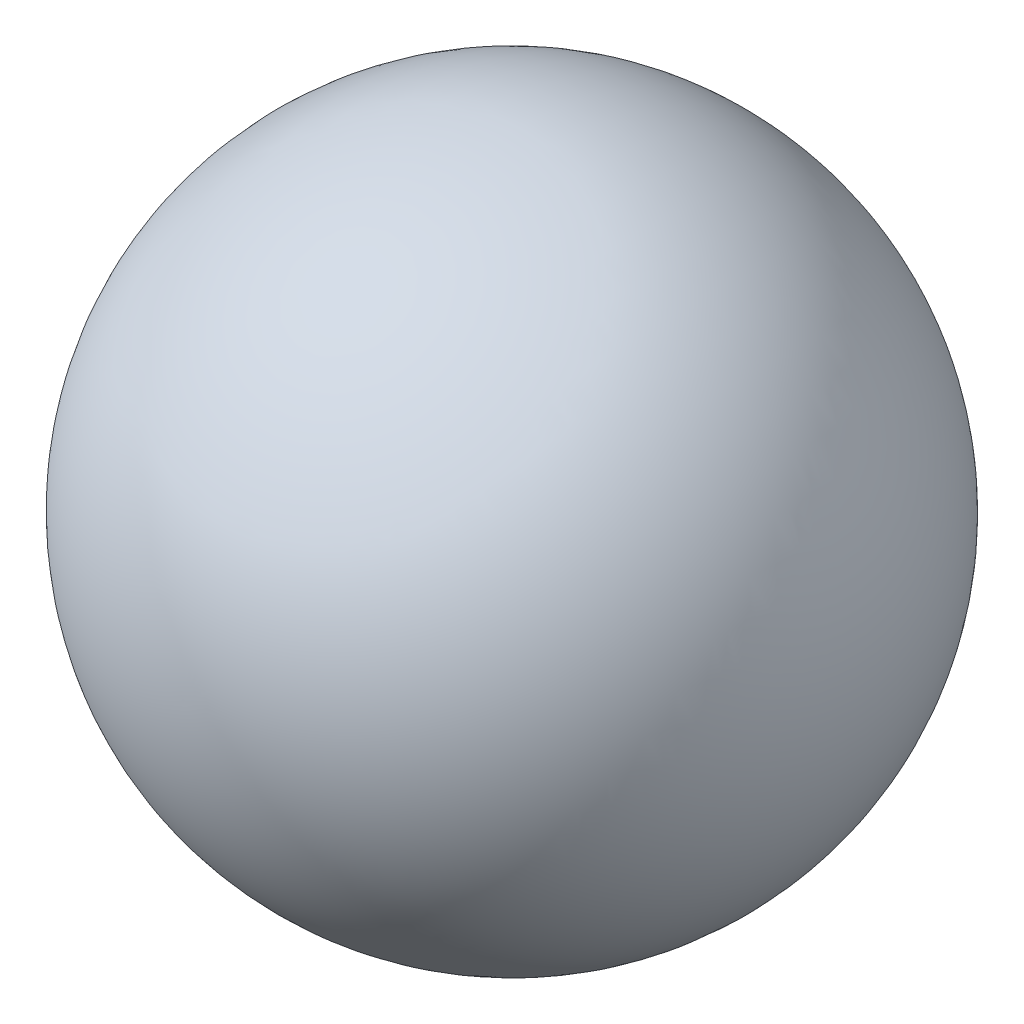
ISO-10303-21;
HEADER;
FILE_DESCRIPTION(('STEP AP214'),'2;1');
FILE_NAME('part.step','',(''),(''),'','','');
FILE_SCHEMA(('AUTOMOTIVE_DESIGN { 1 0 10303 214 1 1 1 1 }'));
ENDSEC;
DATA;
#1=APPLICATION_CONTEXT('core data for automotive mechanical design processes');
#2=APPLICATION_PROTOCOL_DEFINITION('international standard','automotive_design',2000,#1);
#3=PRODUCT_CONTEXT('',#1,'mechanical');
#4=PRODUCT('Part','Part','',(#3));
#5=PRODUCT_RELATED_PRODUCT_CATEGORY('part','',(#4));
#6=PRODUCT_DEFINITION_FORMATION('','',#4);
#7=PRODUCT_DEFINITION_CONTEXT('part definition',#1,'design');
#8=PRODUCT_DEFINITION('design','',#6,#7);
#9=PRODUCT_DEFINITION_SHAPE('','',#8);
#10=(LENGTH_UNIT() NAMED_UNIT(*) SI_UNIT(.MILLI.,.METRE.));
#11=(NAMED_UNIT(*) PLANE_ANGLE_UNIT() SI_UNIT($,.RADIAN.));
#12=(NAMED_UNIT(*) SI_UNIT($,.STERADIAN.) SOLID_ANGLE_UNIT());
#13=UNCERTAINTY_MEASURE_WITH_UNIT(LENGTH_MEASURE(1.E-05),#10,'distance_accuracy_value','');
#14=(GEOMETRIC_REPRESENTATION_CONTEXT(3) GLOBAL_UNCERTAINTY_ASSIGNED_CONTEXT((#13)) GLOBAL_UNIT_ASSIGNED_CONTEXT((#10,
#11,#12)) REPRESENTATION_CONTEXT('',''));
#15=CARTESIAN_POINT('',(0.,0.,0.));
#16=DIRECTION('',(0.,0.,1.));
#17=DIRECTION('',(1.,0.,0.));
#18=AXIS2_PLACEMENT_3D('',#15,#16,#17);
#19=CARTESIAN_POINT('',(0.,0.,0.));
#20=DIRECTION('',(0.,-1.,0.));
#21=DIRECTION('',(-1.,0.,0.));
#22=AXIS2_PLACEMENT_3D('',#19,#20,#21);
#23=CIRCLE('',#22,120.);
#24=TRIMMED_CURVE('',#23,(PARAMETER_VALUE(-1.57495285721996)),
(PARAMETER_VALUE(1.57495285721996)),.T.,.PARAMETER.);
#25=CARTESIAN_POINT('',(0.498782214783057,0.,0.));
#26=DIRECTION('',(0.,0.,-1.));
#27=AXIS1_PLACEMENT('',#25,#26);
#28=SURFACE_OF_REVOLUTION('',#24,#27);
#29=CARTESIAN_POINT('',(0.498782214783057,0.,119.998963396782));
#30=VERTEX_POINT('',#29);
#31=VERTEX_LOOP('',#30);
#32=FACE_BOUND('',#31,.T.);
#33=CARTESIAN_POINT('',(0.498782214783057,0.,-119.998963396782));
#34=VERTEX_POINT('',#33);
#35=VERTEX_LOOP('',#34);
#36=FACE_BOUND('',#35,.T.);
#37=ADVANCED_FACE('F35',(#32,#36),#28,.T.);
#38=CLOSED_SHELL('',(#37));
#39=MANIFOLD_SOLID_BREP('B2',#38);
#40=ADVANCED_BREP_SHAPE_REPRESENTATION('',(#18,#39),#14);
#41=SHAPE_DEFINITION_REPRESENTATION(#9,#40);
ENDSEC;
END-ISO-10303-21;
